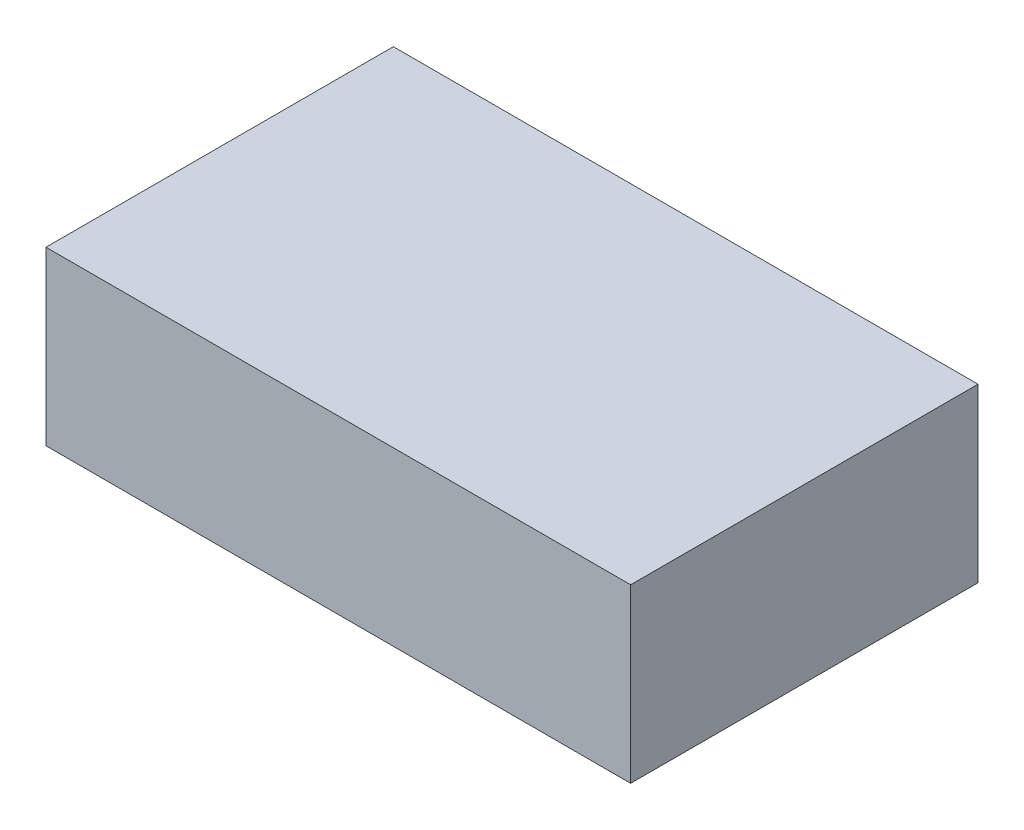
ISO-10303-21;
HEADER;
FILE_DESCRIPTION(('STEP AP214'),'2;1');
FILE_NAME('part.step','',(''),(''),'','','');
FILE_SCHEMA(('AUTOMOTIVE_DESIGN { 1 0 10303 214 1 1 1 1 }'));
ENDSEC;
DATA;
#1=APPLICATION_CONTEXT('core data for automotive mechanical design processes');
#2=APPLICATION_PROTOCOL_DEFINITION('international standard','automotive_design',2000,#1);
#3=PRODUCT_CONTEXT('',#1,'mechanical');
#4=PRODUCT('Part','Part','',(#3));
#5=PRODUCT_RELATED_PRODUCT_CATEGORY('part','',(#4));
#6=PRODUCT_DEFINITION_FORMATION('','',#4);
#7=PRODUCT_DEFINITION_CONTEXT('part definition',#1,'design');
#8=PRODUCT_DEFINITION('design','',#6,#7);
#9=PRODUCT_DEFINITION_SHAPE('','',#8);
#10=(LENGTH_UNIT() NAMED_UNIT(*) SI_UNIT(.MILLI.,.METRE.));
#11=(NAMED_UNIT(*) PLANE_ANGLE_UNIT() SI_UNIT($,.RADIAN.));
#12=(NAMED_UNIT(*) SI_UNIT($,.STERADIAN.) SOLID_ANGLE_UNIT());
#13=UNCERTAINTY_MEASURE_WITH_UNIT(LENGTH_MEASURE(1.E-05),#10,'distance_accuracy_value','');
#14=(GEOMETRIC_REPRESENTATION_CONTEXT(3) GLOBAL_UNCERTAINTY_ASSIGNED_CONTEXT((#13)) GLOBAL_UNIT_ASSIGNED_CONTEXT((#10,
#11,#12)) REPRESENTATION_CONTEXT('',''));
#15=CARTESIAN_POINT('',(0.,0.,0.));
#16=DIRECTION('',(0.,0.,1.));
#17=DIRECTION('',(1.,0.,0.));
#18=AXIS2_PLACEMENT_3D('',#15,#16,#17);
#19=CARTESIAN_POINT('',(0.,25.,0.));
#20=DIRECTION('',(1.,0.,0.));
#21=DIRECTION('',(0.,0.,-1.));
#22=AXIS2_PLACEMENT_3D('',#19,#20,#21);
#23=PLANE('',#22);
#24=DIRECTION('',(0.,0.,1.));
#25=VECTOR('',#24,1.);
#26=CARTESIAN_POINT('',(0.,0.,0.));
#27=LINE('',#26,#25);
#28=CARTESIAN_POINT('',(0.,0.,-50.5));
#29=VERTEX_POINT('',#28);
#30=CARTESIAN_POINT('',(0.,0.,0.));
#31=VERTEX_POINT('',#30);
#32=EDGE_CURVE('E113',#29,#31,#27,.T.);
#33=ORIENTED_EDGE('',*,*,#32,.T.);
#34=DIRECTION('',(0.,-1.,0.));
#35=VECTOR('',#34,1.);
#36=CARTESIAN_POINT('',(0.,25.,0.));
#37=LINE('',#36,#35);
#38=CARTESIAN_POINT('',(0.,25.,0.));
#39=VERTEX_POINT('',#38);
#40=EDGE_CURVE('E11',#39,#31,#37,.T.);
#41=ORIENTED_EDGE('',*,*,#40,.F.);
#42=DIRECTION('',(0.,0.,1.));
#43=VECTOR('',#42,1.);
#44=CARTESIAN_POINT('',(0.,25.,0.));
#45=LINE('',#44,#43);
#46=CARTESIAN_POINT('',(0.,25.,-50.5));
#47=VERTEX_POINT('',#46);
#48=EDGE_CURVE('E97',#47,#39,#45,.T.);
#49=ORIENTED_EDGE('',*,*,#48,.F.);
#50=DIRECTION('',(0.,-1.,0.));
#51=VECTOR('',#50,1.);
#52=CARTESIAN_POINT('',(0.,25.,-50.5));
#53=LINE('',#52,#51);
#54=EDGE_CURVE('E109',#47,#29,#53,.T.);
#55=ORIENTED_EDGE('',*,*,#54,.T.);
#56=EDGE_LOOP('',(#33,#41,#49,#55));
#57=FACE_BOUND('',#56,.T.);
#58=ADVANCED_FACE('F45',(#57),#23,.F.);
#59=CARTESIAN_POINT('',(0.,25.,0.));
#60=DIRECTION('',(0.,0.,-1.));
#61=DIRECTION('',(-1.,0.,0.));
#62=AXIS2_PLACEMENT_3D('',#59,#60,#61);
#63=PLANE('',#62);
#64=DIRECTION('',(1.,0.,0.));
#65=VECTOR('',#64,1.);
#66=CARTESIAN_POINT('',(0.,0.,0.));
#67=LINE('',#66,#65);
#68=CARTESIAN_POINT('',(85.,0.,0.));
#69=VERTEX_POINT('',#68);
#70=EDGE_CURVE('E102',#31,#69,#67,.T.);
#71=ORIENTED_EDGE('',*,*,#70,.T.);
#72=DIRECTION('',(0.,-1.,0.));
#73=VECTOR('',#72,1.);
#74=CARTESIAN_POINT('',(85.,25.,0.));
#75=LINE('',#74,#73);
#76=CARTESIAN_POINT('',(85.,25.,0.));
#77=VERTEX_POINT('',#76);
#78=EDGE_CURVE('E54',#77,#69,#75,.T.);
#79=ORIENTED_EDGE('',*,*,#78,.F.);
#80=DIRECTION('',(1.,0.,0.));
#81=VECTOR('',#80,1.);
#82=CARTESIAN_POINT('',(0.,25.,0.));
#83=LINE('',#82,#81);
#84=EDGE_CURVE('E92',#39,#77,#83,.T.);
#85=ORIENTED_EDGE('',*,*,#84,.F.);
#86=ORIENTED_EDGE('',*,*,#40,.T.);
#87=EDGE_LOOP('',(#71,#79,#85,#86));
#88=FACE_BOUND('',#87,.T.);
#89=ADVANCED_FACE('F101',(#88),#63,.F.);
#90=CARTESIAN_POINT('',(85.,25.,0.));
#91=DIRECTION('',(-1.,0.,0.));
#92=DIRECTION('',(0.,0.,1.));
#93=AXIS2_PLACEMENT_3D('',#90,#91,#92);
#94=PLANE('',#93);
#95=DIRECTION('',(0.,0.,-1.));
#96=VECTOR('',#95,1.);
#97=CARTESIAN_POINT('',(85.,0.,0.));
#98=LINE('',#97,#96);
#99=CARTESIAN_POINT('',(85.,0.,-50.5));
#100=VERTEX_POINT('',#99);
#101=EDGE_CURVE('E79',#69,#100,#98,.T.);
#102=ORIENTED_EDGE('',*,*,#101,.T.);
#103=DIRECTION('',(0.,-1.,0.));
#104=VECTOR('',#103,1.);
#105=CARTESIAN_POINT('',(85.,25.,-50.5));
#106=LINE('',#105,#104);
#107=CARTESIAN_POINT('',(85.,25.,-50.5));
#108=VERTEX_POINT('',#107);
#109=EDGE_CURVE('E104',#108,#100,#106,.T.);
#110=ORIENTED_EDGE('',*,*,#109,.F.);
#111=DIRECTION('',(0.,0.,-1.));
#112=VECTOR('',#111,1.);
#113=CARTESIAN_POINT('',(85.,25.,0.));
#114=LINE('',#113,#112);
#115=EDGE_CURVE('E95',#77,#108,#114,.T.);
#116=ORIENTED_EDGE('',*,*,#115,.F.);
#117=ORIENTED_EDGE('',*,*,#78,.T.);
#118=EDGE_LOOP('',(#102,#110,#116,#117));
#119=FACE_BOUND('',#118,.T.);
#120=ADVANCED_FACE('F105',(#119),#94,.F.);
#121=CARTESIAN_POINT('',(0.,25.,-50.5));
#122=DIRECTION('',(0.,0.,1.));
#123=DIRECTION('',(1.,0.,0.));
#124=AXIS2_PLACEMENT_3D('',#121,#122,#123);
#125=PLANE('',#124);
#126=DIRECTION('',(-1.,0.,0.));
#127=VECTOR('',#126,1.);
#128=CARTESIAN_POINT('',(0.,0.,-50.5));
#129=LINE('',#128,#127);
#130=EDGE_CURVE('E85',#100,#29,#129,.T.);
#131=ORIENTED_EDGE('',*,*,#130,.T.);
#132=ORIENTED_EDGE('',*,*,#54,.F.);
#133=DIRECTION('',(-1.,0.,0.));
#134=VECTOR('',#133,1.);
#135=CARTESIAN_POINT('',(0.,25.,-50.5));
#136=LINE('',#135,#134);
#137=EDGE_CURVE('E62',#108,#47,#136,.T.);
#138=ORIENTED_EDGE('',*,*,#137,.F.);
#139=ORIENTED_EDGE('',*,*,#109,.T.);
#140=EDGE_LOOP('',(#131,#132,#138,#139));
#141=FACE_BOUND('',#140,.T.);
#142=ADVANCED_FACE('F126',(#141),#125,.F.);
#143=CARTESIAN_POINT('',(0.,25.,0.));
#144=DIRECTION('',(0.,-1.,0.));
#145=DIRECTION('',(0.,0.,-1.));
#146=AXIS2_PLACEMENT_3D('',#143,#144,#145);
#147=PLANE('',#146);
#148=ORIENTED_EDGE('',*,*,#48,.T.);
#149=ORIENTED_EDGE('',*,*,#84,.T.);
#150=ORIENTED_EDGE('',*,*,#115,.T.);
#151=ORIENTED_EDGE('',*,*,#137,.T.);
#152=EDGE_LOOP('',(#148,#149,#150,#151));
#153=FACE_BOUND('',#152,.T.);
#154=ADVANCED_FACE('F93',(#153),#147,.F.);
#155=CARTESIAN_POINT('',(0.,0.,0.));
#156=DIRECTION('',(0.,-1.,0.));
#157=DIRECTION('',(0.,0.,-1.));
#158=AXIS2_PLACEMENT_3D('',#155,#156,#157);
#159=PLANE('',#158);
#160=ORIENTED_EDGE('',*,*,#32,.F.);
#161=ORIENTED_EDGE('',*,*,#130,.F.);
#162=ORIENTED_EDGE('',*,*,#101,.F.);
#163=ORIENTED_EDGE('',*,*,#70,.F.);
#164=EDGE_LOOP('',(#160,#161,#162,#163));
#165=FACE_BOUND('',#164,.T.);
#166=ADVANCED_FACE('F129',(#165),#159,.T.);
#167=CLOSED_SHELL('',(#58,#89,#120,#142,#154,#166));
#168=MANIFOLD_SOLID_BREP('B2',#167);
#169=ADVANCED_BREP_SHAPE_REPRESENTATION('',(#18,#168),#14);
#170=SHAPE_DEFINITION_REPRESENTATION(#9,#169);
ENDSEC;
END-ISO-10303-21;
